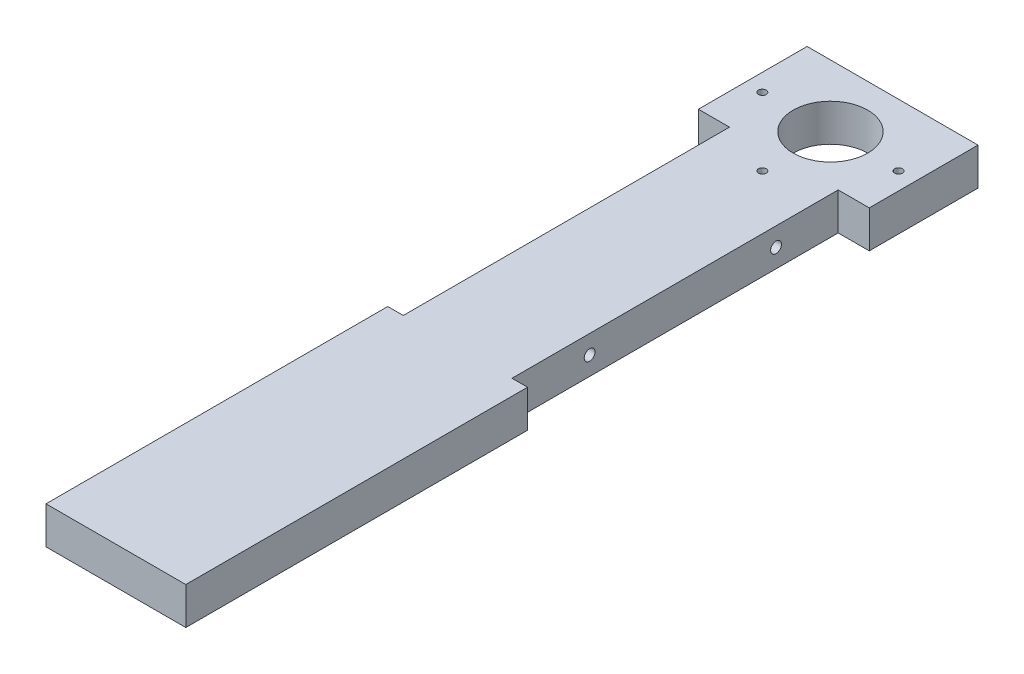
ISO-10303-21;
HEADER;
FILE_DESCRIPTION(('STEP AP214'),'2;1');
FILE_NAME('part.step','',(''),(''),'','','');
FILE_SCHEMA(('AUTOMOTIVE_DESIGN { 1 0 10303 214 1 1 1 1 }'));
ENDSEC;
DATA;
#1=APPLICATION_CONTEXT('core data for automotive mechanical design processes');
#2=APPLICATION_PROTOCOL_DEFINITION('international standard','automotive_design',2000,#1);
#3=PRODUCT_CONTEXT('',#1,'mechanical');
#4=PRODUCT('Part','Part','',(#3));
#5=PRODUCT_RELATED_PRODUCT_CATEGORY('part','',(#4));
#6=PRODUCT_DEFINITION_FORMATION('','',#4);
#7=PRODUCT_DEFINITION_CONTEXT('part definition',#1,'design');
#8=PRODUCT_DEFINITION('design','',#6,#7);
#9=PRODUCT_DEFINITION_SHAPE('','',#8);
#10=(LENGTH_UNIT() NAMED_UNIT(*) SI_UNIT(.MILLI.,.METRE.));
#11=(NAMED_UNIT(*) PLANE_ANGLE_UNIT() SI_UNIT($,.RADIAN.));
#12=(NAMED_UNIT(*) SI_UNIT($,.STERADIAN.) SOLID_ANGLE_UNIT());
#13=UNCERTAINTY_MEASURE_WITH_UNIT(LENGTH_MEASURE(1.E-05),#10,'distance_accuracy_value','');
#14=(GEOMETRIC_REPRESENTATION_CONTEXT(3) GLOBAL_UNCERTAINTY_ASSIGNED_CONTEXT((#13)) GLOBAL_UNIT_ASSIGNED_CONTEXT((#10,
#11,#12)) REPRESENTATION_CONTEXT('',''));
#15=CARTESIAN_POINT('',(0.,0.,0.));
#16=DIRECTION('',(0.,0.,1.));
#17=DIRECTION('',(1.,0.,0.));
#18=AXIS2_PLACEMENT_3D('',#15,#16,#17);
#19=CARTESIAN_POINT('',(22.5,12.,-125.));
#20=DIRECTION('',(-1.,0.,0.));
#21=DIRECTION('',(0.,0.,1.));
#22=AXIS2_PLACEMENT_3D('',#19,#20,#21);
#23=PLANE('',#22);
#24=DIRECTION('',(0.,0.,-1.));
#25=VECTOR('',#24,1.);
#26=CARTESIAN_POINT('',(22.5,0.,-125.));
#27=LINE('',#26,#25);
#28=CARTESIAN_POINT('',(22.5,0.,125.));
#29=VERTEX_POINT('',#28);
#30=CARTESIAN_POINT('',(22.5,0.,15.));
#31=VERTEX_POINT('',#30);
#32=EDGE_CURVE('E227',#29,#31,#27,.T.);
#33=ORIENTED_EDGE('',*,*,#32,.T.);
#34=DIRECTION('',(0.,1.,0.));
#35=VECTOR('',#34,1.);
#36=CARTESIAN_POINT('',(22.5,0.,15.));
#37=LINE('',#36,#35);
#38=CARTESIAN_POINT('',(22.5,12.,15.));
#39=VERTEX_POINT('',#38);
#40=EDGE_CURVE('E223',#31,#39,#37,.T.);
#41=ORIENTED_EDGE('',*,*,#40,.T.);
#42=DIRECTION('',(0.,0.,-1.));
#43=VECTOR('',#42,1.);
#44=CARTESIAN_POINT('',(22.5,12.,-125.));
#45=LINE('',#44,#43);
#46=CARTESIAN_POINT('',(22.5,12.,125.));
#47=VERTEX_POINT('',#46);
#48=EDGE_CURVE('E144',#47,#39,#45,.T.);
#49=ORIENTED_EDGE('',*,*,#48,.F.);
#50=DIRECTION('',(0.,-1.,0.));
#51=VECTOR('',#50,1.);
#52=CARTESIAN_POINT('',(22.5,12.,125.));
#53=LINE('',#52,#51);
#54=EDGE_CURVE('E48',#47,#29,#53,.T.);
#55=ORIENTED_EDGE('',*,*,#54,.T.);
#56=EDGE_LOOP('',(#33,#41,#49,#55));
#57=FACE_BOUND('',#56,.T.);
#58=ADVANCED_FACE('F39',(#57),#23,.F.);
#59=CARTESIAN_POINT('',(-22.5,12.,-125.));
#60=DIRECTION('',(0.,0.,1.));
#61=DIRECTION('',(1.,0.,0.));
#62=AXIS2_PLACEMENT_3D('',#59,#60,#61);
#63=PLANE('',#62);
#64=DIRECTION('',(-1.,0.,0.));
#65=VECTOR('',#64,1.);
#66=CARTESIAN_POINT('',(-22.5,0.,-125.));
#67=LINE('',#66,#65);
#68=CARTESIAN_POINT('',(27.5,0.,-125.));
#69=VERTEX_POINT('',#68);
#70=CARTESIAN_POINT('',(-27.5,0.,-125.));
#71=VERTEX_POINT('',#70);
#72=EDGE_CURVE('E149',#69,#71,#67,.T.);
#73=ORIENTED_EDGE('',*,*,#72,.T.);
#74=DIRECTION('',(0.,1.,0.));
#75=VECTOR('',#74,1.);
#76=CARTESIAN_POINT('',(-27.5,-35.3553390593274,-125.));
#77=LINE('',#76,#75);
#78=CARTESIAN_POINT('',(-27.5,12.,-125.));
#79=VERTEX_POINT('',#78);
#80=EDGE_CURVE('E147',#71,#79,#77,.T.);
#81=ORIENTED_EDGE('',*,*,#80,.T.);
#82=DIRECTION('',(-1.,0.,0.));
#83=VECTOR('',#82,1.);
#84=CARTESIAN_POINT('',(-22.5,12.,-125.));
#85=LINE('',#84,#83);
#86=CARTESIAN_POINT('',(27.5,12.,-125.));
#87=VERTEX_POINT('',#86);
#88=EDGE_CURVE('E130',#87,#79,#85,.T.);
#89=ORIENTED_EDGE('',*,*,#88,.F.);
#90=DIRECTION('',(0.,1.,0.));
#91=VECTOR('',#90,1.);
#92=CARTESIAN_POINT('',(27.5,-35.3553390593274,-125.));
#93=LINE('',#92,#91);
#94=EDGE_CURVE('E175',#69,#87,#93,.T.);
#95=ORIENTED_EDGE('',*,*,#94,.F.);
#96=EDGE_LOOP('',(#73,#81,#89,#95));
#97=FACE_BOUND('',#96,.T.);
#98=ADVANCED_FACE('F148',(#97),#63,.F.);
#99=CARTESIAN_POINT('',(-22.5,12.,-125.));
#100=DIRECTION('',(1.,0.,0.));
#101=DIRECTION('',(0.,0.,-1.));
#102=AXIS2_PLACEMENT_3D('',#99,#100,#101);
#103=PLANE('',#102);
#104=DIRECTION('',(0.,0.,1.));
#105=VECTOR('',#104,1.);
#106=CARTESIAN_POINT('',(-22.5,12.,-125.));
#107=LINE('',#106,#105);
#108=CARTESIAN_POINT('',(-22.5,12.,15.));
#109=VERTEX_POINT('',#108);
#110=CARTESIAN_POINT('',(-22.5,12.,125.));
#111=VERTEX_POINT('',#110);
#112=EDGE_CURVE('E143',#109,#111,#107,.T.);
#113=ORIENTED_EDGE('',*,*,#112,.F.);
#114=DIRECTION('',(0.,1.,0.));
#115=VECTOR('',#114,1.);
#116=CARTESIAN_POINT('',(-22.5,0.,15.));
#117=LINE('',#116,#115);
#118=CARTESIAN_POINT('',(-22.5,0.,15.));
#119=VERTEX_POINT('',#118);
#120=EDGE_CURVE('E243',#119,#109,#117,.T.);
#121=ORIENTED_EDGE('',*,*,#120,.F.);
#122=DIRECTION('',(0.,0.,1.));
#123=VECTOR('',#122,1.);
#124=CARTESIAN_POINT('',(-22.5,0.,-125.));
#125=LINE('',#124,#123);
#126=CARTESIAN_POINT('',(-22.5,0.,125.));
#127=VERTEX_POINT('',#126);
#128=EDGE_CURVE('E274',#119,#127,#125,.T.);
#129=ORIENTED_EDGE('',*,*,#128,.T.);
#130=DIRECTION('',(0.,-1.,0.));
#131=VECTOR('',#130,1.);
#132=CARTESIAN_POINT('',(-22.5,12.,125.));
#133=LINE('',#132,#131);
#134=EDGE_CURVE('E11',#111,#127,#133,.T.);
#135=ORIENTED_EDGE('',*,*,#134,.F.);
#136=EDGE_LOOP('',(#113,#121,#129,#135));
#137=FACE_BOUND('',#136,.T.);
#138=ADVANCED_FACE('F318',(#137),#103,.F.);
#139=CARTESIAN_POINT('',(-22.5,12.,125.));
#140=DIRECTION('',(0.,0.,-1.));
#141=DIRECTION('',(-1.,0.,0.));
#142=AXIS2_PLACEMENT_3D('',#139,#140,#141);
#143=PLANE('',#142);
#144=DIRECTION('',(1.,0.,0.));
#145=VECTOR('',#144,1.);
#146=CARTESIAN_POINT('',(-22.5,0.,125.));
#147=LINE('',#146,#145);
#148=EDGE_CURVE('E262',#127,#29,#147,.T.);
#149=ORIENTED_EDGE('',*,*,#148,.T.);
#150=ORIENTED_EDGE('',*,*,#54,.F.);
#151=DIRECTION('',(1.,0.,0.));
#152=VECTOR('',#151,1.);
#153=CARTESIAN_POINT('',(-22.5,12.,125.));
#154=LINE('',#153,#152);
#155=EDGE_CURVE('E266',#111,#47,#154,.T.);
#156=ORIENTED_EDGE('',*,*,#155,.F.);
#157=ORIENTED_EDGE('',*,*,#134,.T.);
#158=EDGE_LOOP('',(#149,#150,#156,#157));
#159=FACE_BOUND('',#158,.T.);
#160=ADVANCED_FACE('F334',(#159),#143,.F.);
#161=CARTESIAN_POINT('',(0.,12.,0.));
#162=DIRECTION('',(0.,1.,0.));
#163=DIRECTION('',(0.,0.,1.));
#164=AXIS2_PLACEMENT_3D('',#161,#162,#163);
#165=PLANE('',#164);
#166=CARTESIAN_POINT('',(0.,12.,-83.0796897832167));
#167=DIRECTION('',(0.,1.,0.));
#168=DIRECTION('',(0.,0.,1.));
#169=AXIS2_PLACEMENT_3D('',#166,#167,#168);
#170=CIRCLE('',#169,1.25);
#171=CARTESIAN_POINT('',(0.,12.,-81.8296897832167));
#172=VERTEX_POINT('',#171);
#173=EDGE_CURVE('E544',#172,#172,#170,.T.);
#174=ORIENTED_EDGE('',*,*,#173,.F.);
#175=EDGE_LOOP('',(#174));
#176=FACE_BOUND('',#175,.T.);
#177=CARTESIAN_POINT('',(-21.9203102167833,12.,-105.));
#178=DIRECTION('',(0.,1.,0.));
#179=DIRECTION('',(0.,0.,1.));
#180=AXIS2_PLACEMENT_3D('',#177,#178,#179);
#181=CIRCLE('',#180,1.25);
#182=CARTESIAN_POINT('',(-21.9203102167833,12.,-103.75));
#183=VERTEX_POINT('',#182);
#184=EDGE_CURVE('E541',#183,#183,#181,.T.);
#185=ORIENTED_EDGE('',*,*,#184,.F.);
#186=EDGE_LOOP('',(#185));
#187=FACE_BOUND('',#186,.T.);
#188=CARTESIAN_POINT('',(21.9203102167833,12.,-105.));
#189=DIRECTION('',(0.,1.,0.));
#190=DIRECTION('',(0.,0.,1.));
#191=AXIS2_PLACEMENT_3D('',#188,#189,#190);
#192=CIRCLE('',#191,1.25);
#193=CARTESIAN_POINT('',(21.9203102167833,12.,-103.75));
#194=VERTEX_POINT('',#193);
#195=EDGE_CURVE('E538',#194,#194,#192,.T.);
#196=ORIENTED_EDGE('',*,*,#195,.F.);
#197=EDGE_LOOP('',(#196));
#198=FACE_BOUND('',#197,.T.);
#199=CARTESIAN_POINT('',(0.,12.,-105.));
#200=DIRECTION('',(0.,1.,0.));
#201=DIRECTION('',(0.,0.,1.));
#202=AXIS2_PLACEMENT_3D('',#199,#200,#201);
#203=CIRCLE('',#202,12.);
#204=CARTESIAN_POINT('',(0.,12.,-93.));
#205=VERTEX_POINT('',#204);
#206=EDGE_CURVE('E287',#205,#205,#203,.T.);
#207=ORIENTED_EDGE('',*,*,#206,.F.);
#208=EDGE_LOOP('',(#207));
#209=FACE_BOUND('',#208,.T.);
#210=DIRECTION('',(1.,0.,0.));
#211=VECTOR('',#210,1.);
#212=CARTESIAN_POINT('',(22.5,12.,15.));
#213=LINE('',#212,#211);
#214=CARTESIAN_POINT('',(17.5,12.,15.));
#215=VERTEX_POINT('',#214);
#216=EDGE_CURVE('E204',#215,#39,#213,.T.);
#217=ORIENTED_EDGE('',*,*,#216,.F.);
#218=DIRECTION('',(0.,0.,1.));
#219=VECTOR('',#218,1.);
#220=CARTESIAN_POINT('',(17.5,12.,-90.));
#221=LINE('',#220,#219);
#222=CARTESIAN_POINT('',(17.5,12.,-90.));
#223=VERTEX_POINT('',#222);
#224=EDGE_CURVE('E216',#223,#215,#221,.T.);
#225=ORIENTED_EDGE('',*,*,#224,.F.);
#226=DIRECTION('',(-1.,0.,0.));
#227=VECTOR('',#226,1.);
#228=CARTESIAN_POINT('',(22.5,12.,-90.));
#229=LINE('',#228,#227);
#230=CARTESIAN_POINT('',(27.5,12.,-90.));
#231=VERTEX_POINT('',#230);
#232=EDGE_CURVE('E212',#231,#223,#229,.T.);
#233=ORIENTED_EDGE('',*,*,#232,.F.);
#234=DIRECTION('',(0.,0.,-1.));
#235=VECTOR('',#234,1.);
#236=CARTESIAN_POINT('',(27.5,12.,-125.));
#237=LINE('',#236,#235);
#238=EDGE_CURVE('E138',#231,#87,#237,.T.);
#239=ORIENTED_EDGE('',*,*,#238,.T.);
#240=ORIENTED_EDGE('',*,*,#88,.T.);
#241=DIRECTION('',(0.,0.,1.));
#242=VECTOR('',#241,1.);
#243=CARTESIAN_POINT('',(-27.5,12.,-125.));
#244=LINE('',#243,#242);
#245=CARTESIAN_POINT('',(-27.5,12.,-90.));
#246=VERTEX_POINT('',#245);
#247=EDGE_CURVE('E136',#79,#246,#244,.T.);
#248=ORIENTED_EDGE('',*,*,#247,.T.);
#249=DIRECTION('',(-1.,0.,0.));
#250=VECTOR('',#249,1.);
#251=CARTESIAN_POINT('',(-22.5,12.,-90.));
#252=LINE('',#251,#250);
#253=CARTESIAN_POINT('',(-17.5,12.,-90.));
#254=VERTEX_POINT('',#253);
#255=EDGE_CURVE('E237',#254,#246,#252,.T.);
#256=ORIENTED_EDGE('',*,*,#255,.F.);
#257=DIRECTION('',(0.,0.,-1.));
#258=VECTOR('',#257,1.);
#259=CARTESIAN_POINT('',(-17.5,12.,-90.));
#260=LINE('',#259,#258);
#261=CARTESIAN_POINT('',(-17.5,12.,15.));
#262=VERTEX_POINT('',#261);
#263=EDGE_CURVE('E247',#262,#254,#260,.T.);
#264=ORIENTED_EDGE('',*,*,#263,.F.);
#265=DIRECTION('',(1.,0.,0.));
#266=VECTOR('',#265,1.);
#267=CARTESIAN_POINT('',(-22.5,12.,15.));
#268=LINE('',#267,#266);
#269=EDGE_CURVE('E188',#109,#262,#268,.T.);
#270=ORIENTED_EDGE('',*,*,#269,.F.);
#271=ORIENTED_EDGE('',*,*,#112,.T.);
#272=ORIENTED_EDGE('',*,*,#155,.T.);
#273=ORIENTED_EDGE('',*,*,#48,.T.);
#274=EDGE_LOOP('',(#217,#225,#233,#239,#240,#248,#256,#264,#270,#271,#272,#273));
#275=FACE_BOUND('',#274,.T.);
#276=ADVANCED_FACE('F133',(#176,#187,#198,#209,#275),#165,.T.);
#277=CARTESIAN_POINT('',(0.,0.,0.));
#278=DIRECTION('',(0.,1.,0.));
#279=DIRECTION('',(0.,0.,1.));
#280=AXIS2_PLACEMENT_3D('',#277,#278,#279);
#281=PLANE('',#280);
#282=CARTESIAN_POINT('',(0.,0.,-83.0796897832167));
#283=DIRECTION('',(0.,1.,0.));
#284=DIRECTION('',(0.,0.,1.));
#285=AXIS2_PLACEMENT_3D('',#282,#283,#284);
#286=CIRCLE('',#285,1.25);
#287=CARTESIAN_POINT('',(0.,0.,-81.8296897832167));
#288=VERTEX_POINT('',#287);
#289=EDGE_CURVE('E42',#288,#288,#286,.T.);
#290=ORIENTED_EDGE('',*,*,#289,.T.);
#291=EDGE_LOOP('',(#290));
#292=FACE_BOUND('',#291,.T.);
#293=CARTESIAN_POINT('',(-21.9203102167833,0.,-105.));
#294=DIRECTION('',(0.,1.,0.));
#295=DIRECTION('',(0.,0.,1.));
#296=AXIS2_PLACEMENT_3D('',#293,#294,#295);
#297=CIRCLE('',#296,1.25);
#298=CARTESIAN_POINT('',(-21.9203102167833,0.,-103.75));
#299=VERTEX_POINT('',#298);
#300=EDGE_CURVE('E163',#299,#299,#297,.T.);
#301=ORIENTED_EDGE('',*,*,#300,.T.);
#302=EDGE_LOOP('',(#301));
#303=FACE_BOUND('',#302,.T.);
#304=CARTESIAN_POINT('',(21.9203102167833,0.,-105.));
#305=DIRECTION('',(0.,1.,0.));
#306=DIRECTION('',(0.,0.,1.));
#307=AXIS2_PLACEMENT_3D('',#304,#305,#306);
#308=CIRCLE('',#307,1.25);
#309=CARTESIAN_POINT('',(21.9203102167833,0.,-103.75));
#310=VERTEX_POINT('',#309);
#311=EDGE_CURVE('E286',#310,#310,#308,.T.);
#312=ORIENTED_EDGE('',*,*,#311,.T.);
#313=EDGE_LOOP('',(#312));
#314=FACE_BOUND('',#313,.T.);
#315=CARTESIAN_POINT('',(0.,0.,-105.));
#316=DIRECTION('',(0.,1.,0.));
#317=DIRECTION('',(0.,0.,1.));
#318=AXIS2_PLACEMENT_3D('',#315,#316,#317);
#319=CIRCLE('',#318,12.);
#320=CARTESIAN_POINT('',(0.,0.,-93.));
#321=VERTEX_POINT('',#320);
#322=EDGE_CURVE('E282',#321,#321,#319,.T.);
#323=ORIENTED_EDGE('',*,*,#322,.T.);
#324=EDGE_LOOP('',(#323));
#325=FACE_BOUND('',#324,.T.);
#326=DIRECTION('',(0.,0.,1.));
#327=VECTOR('',#326,1.);
#328=CARTESIAN_POINT('',(17.5,0.,-90.));
#329=LINE('',#328,#327);
#330=CARTESIAN_POINT('',(17.5,0.,-90.));
#331=VERTEX_POINT('',#330);
#332=CARTESIAN_POINT('',(17.5,0.,15.));
#333=VERTEX_POINT('',#332);
#334=EDGE_CURVE('E56',#331,#333,#329,.T.);
#335=ORIENTED_EDGE('',*,*,#334,.T.);
#336=DIRECTION('',(1.,0.,0.));
#337=VECTOR('',#336,1.);
#338=CARTESIAN_POINT('',(22.5,0.,15.));
#339=LINE('',#338,#337);
#340=EDGE_CURVE('E207',#333,#31,#339,.T.);
#341=ORIENTED_EDGE('',*,*,#340,.T.);
#342=ORIENTED_EDGE('',*,*,#32,.F.);
#343=ORIENTED_EDGE('',*,*,#148,.F.);
#344=ORIENTED_EDGE('',*,*,#128,.F.);
#345=DIRECTION('',(1.,0.,0.));
#346=VECTOR('',#345,1.);
#347=CARTESIAN_POINT('',(-22.5,0.,15.));
#348=LINE('',#347,#346);
#349=CARTESIAN_POINT('',(-17.5,0.,15.));
#350=VERTEX_POINT('',#349);
#351=EDGE_CURVE('E233',#119,#350,#348,.T.);
#352=ORIENTED_EDGE('',*,*,#351,.T.);
#353=DIRECTION('',(0.,0.,-1.));
#354=VECTOR('',#353,1.);
#355=CARTESIAN_POINT('',(-17.5,0.,-90.));
#356=LINE('',#355,#354);
#357=CARTESIAN_POINT('',(-17.5,0.,-90.));
#358=VERTEX_POINT('',#357);
#359=EDGE_CURVE('E64',#350,#358,#356,.T.);
#360=ORIENTED_EDGE('',*,*,#359,.T.);
#361=DIRECTION('',(-1.,0.,0.));
#362=VECTOR('',#361,1.);
#363=CARTESIAN_POINT('',(-22.5,0.,-90.));
#364=LINE('',#363,#362);
#365=CARTESIAN_POINT('',(-27.5,0.,-90.));
#366=VERTEX_POINT('',#365);
#367=EDGE_CURVE('E240',#358,#366,#364,.T.);
#368=ORIENTED_EDGE('',*,*,#367,.T.);
#369=DIRECTION('',(0.,0.,-1.));
#370=VECTOR('',#369,1.);
#371=CARTESIAN_POINT('',(-27.5,0.,-125.));
#372=LINE('',#371,#370);
#373=EDGE_CURVE('E166',#366,#71,#372,.T.);
#374=ORIENTED_EDGE('',*,*,#373,.T.);
#375=ORIENTED_EDGE('',*,*,#72,.F.);
#376=DIRECTION('',(0.,0.,1.));
#377=VECTOR('',#376,1.);
#378=CARTESIAN_POINT('',(27.5,0.,-125.));
#379=LINE('',#378,#377);
#380=CARTESIAN_POINT('',(27.5,0.,-90.));
#381=VERTEX_POINT('',#380);
#382=EDGE_CURVE('E170',#69,#381,#379,.T.);
#383=ORIENTED_EDGE('',*,*,#382,.T.);
#384=DIRECTION('',(-1.,0.,0.));
#385=VECTOR('',#384,1.);
#386=CARTESIAN_POINT('',(22.5,0.,-90.));
#387=LINE('',#386,#385);
#388=EDGE_CURVE('E200',#381,#331,#387,.T.);
#389=ORIENTED_EDGE('',*,*,#388,.T.);
#390=EDGE_LOOP('',(#335,#341,#342,#343,#344,#352,#360,#368,#374,#375,#383,#389));
#391=FACE_BOUND('',#390,.T.);
#392=ADVANCED_FACE('F294',(#292,#303,#314,#325,#391),#281,.F.);
#393=CARTESIAN_POINT('',(-22.5,0.,-90.));
#394=DIRECTION('',(0.,0.,-1.));
#395=DIRECTION('',(-1.,0.,0.));
#396=AXIS2_PLACEMENT_3D('',#393,#394,#395);
#397=PLANE('',#396);
#398=ORIENTED_EDGE('',*,*,#255,.T.);
#399=DIRECTION('',(0.,1.,0.));
#400=VECTOR('',#399,1.);
#401=CARTESIAN_POINT('',(-27.5,-35.3553390593274,-90.));
#402=LINE('',#401,#400);
#403=EDGE_CURVE('E154',#366,#246,#402,.T.);
#404=ORIENTED_EDGE('',*,*,#403,.F.);
#405=ORIENTED_EDGE('',*,*,#367,.F.);
#406=DIRECTION('',(0.,1.,0.));
#407=VECTOR('',#406,1.);
#408=CARTESIAN_POINT('',(-17.5,0.,-90.));
#409=LINE('',#408,#407);
#410=EDGE_CURVE('E217',#358,#254,#409,.T.);
#411=ORIENTED_EDGE('',*,*,#410,.T.);
#412=EDGE_LOOP('',(#398,#404,#405,#411));
#413=FACE_BOUND('',#412,.T.);
#414=ADVANCED_FACE('F343',(#413),#397,.F.);
#415=CARTESIAN_POINT('',(-17.5,0.,-90.));
#416=DIRECTION('',(1.,0.,0.));
#417=DIRECTION('',(0.,0.,-1.));
#418=AXIS2_PLACEMENT_3D('',#415,#416,#417);
#419=PLANE('',#418);
#420=CARTESIAN_POINT('',(-17.5,5.99999999999999,-10.));
#421=DIRECTION('',(1.,0.,0.));
#422=DIRECTION('',(0.,0.,-1.));
#423=AXIS2_PLACEMENT_3D('',#420,#421,#422);
#424=CIRCLE('',#423,1.75);
#425=CARTESIAN_POINT('',(-17.5,5.99999999999999,-11.75));
#426=VERTEX_POINT('',#425);
#427=EDGE_CURVE('E184',#426,#426,#424,.T.);
#428=ORIENTED_EDGE('',*,*,#427,.T.);
#429=EDGE_LOOP('',(#428));
#430=FACE_BOUND('',#429,.T.);
#431=CARTESIAN_POINT('',(-17.5,6.,-70.));
#432=DIRECTION('',(1.,0.,0.));
#433=DIRECTION('',(0.,0.,-1.));
#434=AXIS2_PLACEMENT_3D('',#431,#432,#433);
#435=CIRCLE('',#434,1.75);
#436=CARTESIAN_POINT('',(-17.5,6.,-71.75));
#437=VERTEX_POINT('',#436);
#438=EDGE_CURVE('E193',#437,#437,#435,.T.);
#439=ORIENTED_EDGE('',*,*,#438,.T.);
#440=EDGE_LOOP('',(#439));
#441=FACE_BOUND('',#440,.T.);
#442=ORIENTED_EDGE('',*,*,#263,.T.);
#443=ORIENTED_EDGE('',*,*,#410,.F.);
#444=ORIENTED_EDGE('',*,*,#359,.F.);
#445=DIRECTION('',(0.,1.,0.));
#446=VECTOR('',#445,1.);
#447=CARTESIAN_POINT('',(-17.5,0.,15.));
#448=LINE('',#447,#446);
#449=EDGE_CURVE('E255',#350,#262,#448,.T.);
#450=ORIENTED_EDGE('',*,*,#449,.T.);
#451=EDGE_LOOP('',(#442,#443,#444,#450));
#452=FACE_BOUND('',#451,.T.);
#453=ADVANCED_FACE('F340',(#430,#441,#452),#419,.F.);
#454=CARTESIAN_POINT('',(-22.5,0.,15.));
#455=DIRECTION('',(0.,0.,1.));
#456=DIRECTION('',(1.,0.,0.));
#457=AXIS2_PLACEMENT_3D('',#454,#455,#456);
#458=PLANE('',#457);
#459=ORIENTED_EDGE('',*,*,#269,.T.);
#460=ORIENTED_EDGE('',*,*,#449,.F.);
#461=ORIENTED_EDGE('',*,*,#351,.F.);
#462=ORIENTED_EDGE('',*,*,#120,.T.);
#463=EDGE_LOOP('',(#459,#460,#461,#462));
#464=FACE_BOUND('',#463,.T.);
#465=ADVANCED_FACE('F338',(#464),#458,.F.);
#466=CARTESIAN_POINT('',(22.5,0.,15.));
#467=DIRECTION('',(0.,0.,1.));
#468=DIRECTION('',(1.,0.,0.));
#469=AXIS2_PLACEMENT_3D('',#466,#467,#468);
#470=PLANE('',#469);
#471=ORIENTED_EDGE('',*,*,#216,.T.);
#472=ORIENTED_EDGE('',*,*,#40,.F.);
#473=ORIENTED_EDGE('',*,*,#340,.F.);
#474=DIRECTION('',(0.,1.,0.));
#475=VECTOR('',#474,1.);
#476=CARTESIAN_POINT('',(17.5,0.,15.));
#477=LINE('',#476,#475);
#478=EDGE_CURVE('E228',#333,#215,#477,.T.);
#479=ORIENTED_EDGE('',*,*,#478,.T.);
#480=EDGE_LOOP('',(#471,#472,#473,#479));
#481=FACE_BOUND('',#480,.T.);
#482=ADVANCED_FACE('F327',(#481),#470,.F.);
#483=CARTESIAN_POINT('',(17.5,0.,-90.));
#484=DIRECTION('',(-1.,0.,0.));
#485=DIRECTION('',(0.,0.,1.));
#486=AXIS2_PLACEMENT_3D('',#483,#484,#485);
#487=PLANE('',#486);
#488=CARTESIAN_POINT('',(17.5,5.99999999999999,-10.));
#489=DIRECTION('',(1.,0.,0.));
#490=DIRECTION('',(0.,0.,-1.));
#491=AXIS2_PLACEMENT_3D('',#488,#489,#490);
#492=CIRCLE('',#491,1.75);
#493=CARTESIAN_POINT('',(17.5,5.99999999999999,-11.75));
#494=VERTEX_POINT('',#493);
#495=EDGE_CURVE('E189',#494,#494,#492,.T.);
#496=ORIENTED_EDGE('',*,*,#495,.F.);
#497=EDGE_LOOP('',(#496));
#498=FACE_BOUND('',#497,.T.);
#499=CARTESIAN_POINT('',(17.5,6.,-70.));
#500=DIRECTION('',(1.,0.,0.));
#501=DIRECTION('',(0.,0.,-1.));
#502=AXIS2_PLACEMENT_3D('',#499,#500,#501);
#503=CIRCLE('',#502,1.75);
#504=CARTESIAN_POINT('',(17.5,6.,-71.75));
#505=VERTEX_POINT('',#504);
#506=EDGE_CURVE('E174',#505,#505,#503,.T.);
#507=ORIENTED_EDGE('',*,*,#506,.F.);
#508=EDGE_LOOP('',(#507));
#509=FACE_BOUND('',#508,.T.);
#510=ORIENTED_EDGE('',*,*,#224,.T.);
#511=ORIENTED_EDGE('',*,*,#478,.F.);
#512=ORIENTED_EDGE('',*,*,#334,.F.);
#513=DIRECTION('',(0.,1.,0.));
#514=VECTOR('',#513,1.);
#515=CARTESIAN_POINT('',(17.5,0.,-90.));
#516=LINE('',#515,#514);
#517=EDGE_CURVE('E211',#331,#223,#516,.T.);
#518=ORIENTED_EDGE('',*,*,#517,.T.);
#519=EDGE_LOOP('',(#510,#511,#512,#518));
#520=FACE_BOUND('',#519,.T.);
#521=ADVANCED_FACE('F351',(#498,#509,#520),#487,.F.);
#522=CARTESIAN_POINT('',(22.5,0.,-90.));
#523=DIRECTION('',(0.,0.,-1.));
#524=DIRECTION('',(-1.,0.,0.));
#525=AXIS2_PLACEMENT_3D('',#522,#523,#524);
#526=PLANE('',#525);
#527=ORIENTED_EDGE('',*,*,#232,.T.);
#528=ORIENTED_EDGE('',*,*,#517,.F.);
#529=ORIENTED_EDGE('',*,*,#388,.F.);
#530=DIRECTION('',(0.,1.,0.));
#531=VECTOR('',#530,1.);
#532=CARTESIAN_POINT('',(27.5,-35.3553390593274,-90.));
#533=LINE('',#532,#531);
#534=EDGE_CURVE('E178',#381,#231,#533,.T.);
#535=ORIENTED_EDGE('',*,*,#534,.T.);
#536=EDGE_LOOP('',(#527,#528,#529,#535));
#537=FACE_BOUND('',#536,.T.);
#538=ADVANCED_FACE('F350',(#537),#526,.F.);
#539=CARTESIAN_POINT('',(-17.5,6.,-70.));
#540=DIRECTION('',(1.,0.,0.));
#541=DIRECTION('',(0.,0.,-1.));
#542=AXIS2_PLACEMENT_3D('',#539,#540,#541);
#543=CYLINDRICAL_SURFACE('',#542,1.75);
#544=ORIENTED_EDGE('',*,*,#438,.F.);
#545=EDGE_LOOP('',(#544));
#546=FACE_BOUND('',#545,.T.);
#547=ORIENTED_EDGE('',*,*,#506,.T.);
#548=EDGE_LOOP('',(#547));
#549=FACE_BOUND('',#548,.T.);
#550=ADVANCED_FACE('F359',(#546,#549),#543,.F.);
#551=CARTESIAN_POINT('',(-17.5,5.99999999999999,-10.));
#552=DIRECTION('',(1.,0.,0.));
#553=DIRECTION('',(0.,0.,-1.));
#554=AXIS2_PLACEMENT_3D('',#551,#552,#553);
#555=CYLINDRICAL_SURFACE('',#554,1.75);
#556=ORIENTED_EDGE('',*,*,#427,.F.);
#557=EDGE_LOOP('',(#556));
#558=FACE_BOUND('',#557,.T.);
#559=ORIENTED_EDGE('',*,*,#495,.T.);
#560=EDGE_LOOP('',(#559));
#561=FACE_BOUND('',#560,.T.);
#562=ADVANCED_FACE('F440',(#558,#561),#555,.F.);
#563=CARTESIAN_POINT('',(27.5,-35.3553390593274,-125.));
#564=DIRECTION('',(1.,0.,0.));
#565=DIRECTION('',(0.,0.,-1.));
#566=AXIS2_PLACEMENT_3D('',#563,#564,#565);
#567=PLANE('',#566);
#568=ORIENTED_EDGE('',*,*,#382,.F.);
#569=ORIENTED_EDGE('',*,*,#94,.T.);
#570=ORIENTED_EDGE('',*,*,#238,.F.);
#571=ORIENTED_EDGE('',*,*,#534,.F.);
#572=EDGE_LOOP('',(#568,#569,#570,#571));
#573=FACE_BOUND('',#572,.T.);
#574=ADVANCED_FACE('F348',(#573),#567,.T.);
#575=CARTESIAN_POINT('',(-27.5,-35.3553390593274,-125.));
#576=DIRECTION('',(-1.,0.,0.));
#577=DIRECTION('',(0.,0.,1.));
#578=AXIS2_PLACEMENT_3D('',#575,#576,#577);
#579=PLANE('',#578);
#580=ORIENTED_EDGE('',*,*,#373,.F.);
#581=ORIENTED_EDGE('',*,*,#403,.T.);
#582=ORIENTED_EDGE('',*,*,#247,.F.);
#583=ORIENTED_EDGE('',*,*,#80,.F.);
#584=EDGE_LOOP('',(#580,#581,#582,#583));
#585=FACE_BOUND('',#584,.T.);
#586=ADVANCED_FACE('F157',(#585),#579,.T.);
#587=CARTESIAN_POINT('',(0.,-23.,-105.));
#588=DIRECTION('',(0.,1.,0.));
#589=DIRECTION('',(0.,0.,1.));
#590=AXIS2_PLACEMENT_3D('',#587,#588,#589);
#591=CYLINDRICAL_SURFACE('',#590,12.);
#592=ORIENTED_EDGE('',*,*,#206,.T.);
#593=EDGE_LOOP('',(#592));
#594=FACE_BOUND('',#593,.T.);
#595=ORIENTED_EDGE('',*,*,#322,.F.);
#596=EDGE_LOOP('',(#595));
#597=FACE_BOUND('',#596,.T.);
#598=ADVANCED_FACE('F309',(#594,#597),#591,.F.);
#599=CARTESIAN_POINT('',(21.9203102167833,-23.,-105.));
#600=DIRECTION('',(0.,1.,0.));
#601=DIRECTION('',(0.,0.,1.));
#602=AXIS2_PLACEMENT_3D('',#599,#600,#601);
#603=CYLINDRICAL_SURFACE('',#602,1.25);
#604=ORIENTED_EDGE('',*,*,#195,.T.);
#605=EDGE_LOOP('',(#604));
#606=FACE_BOUND('',#605,.T.);
#607=ORIENTED_EDGE('',*,*,#311,.F.);
#608=EDGE_LOOP('',(#607));
#609=FACE_BOUND('',#608,.T.);
#610=ADVANCED_FACE('F300',(#606,#609),#603,.F.);
#611=CARTESIAN_POINT('',(-21.9203102167833,-23.,-105.));
#612=DIRECTION('',(0.,1.,0.));
#613=DIRECTION('',(0.,0.,1.));
#614=AXIS2_PLACEMENT_3D('',#611,#612,#613);
#615=CYLINDRICAL_SURFACE('',#614,1.25);
#616=ORIENTED_EDGE('',*,*,#184,.T.);
#617=EDGE_LOOP('',(#616));
#618=FACE_BOUND('',#617,.T.);
#619=ORIENTED_EDGE('',*,*,#300,.F.);
#620=EDGE_LOOP('',(#619));
#621=FACE_BOUND('',#620,.T.);
#622=ADVANCED_FACE('F297',(#618,#621),#615,.F.);
#623=CARTESIAN_POINT('',(0.,-23.,-83.0796897832167));
#624=DIRECTION('',(0.,1.,0.));
#625=DIRECTION('',(0.,0.,1.));
#626=AXIS2_PLACEMENT_3D('',#623,#624,#625);
#627=CYLINDRICAL_SURFACE('',#626,1.25);
#628=ORIENTED_EDGE('',*,*,#173,.T.);
#629=EDGE_LOOP('',(#628));
#630=FACE_BOUND('',#629,.T.);
#631=ORIENTED_EDGE('',*,*,#289,.F.);
#632=EDGE_LOOP('',(#631));
#633=FACE_BOUND('',#632,.T.);
#634=ADVANCED_FACE('F299',(#630,#633),#627,.F.);
#635=CLOSED_SHELL('',(#58,#98,#138,#160,#276,#392,#414,#453,#465,#482,#521,#538,#550,#562,#574,
#586,#598,#610,#622,#634));
#636=MANIFOLD_SOLID_BREP('B2',#635);
#637=ADVANCED_BREP_SHAPE_REPRESENTATION('',(#18,#636),#14);
#638=SHAPE_DEFINITION_REPRESENTATION(#9,#637);
ENDSEC;
END-ISO-10303-21;
